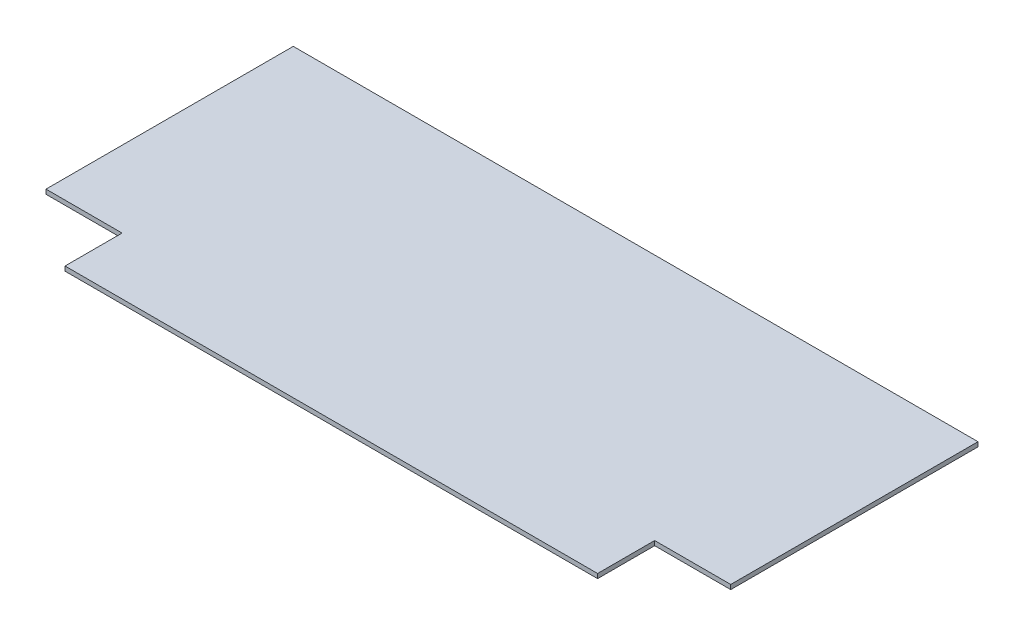
ISO-10303-21;
HEADER;
FILE_DESCRIPTION(('STEP AP214'),'2;1');
FILE_NAME('part.step','',(''),(''),'','','');
FILE_SCHEMA(('AUTOMOTIVE_DESIGN { 1 0 10303 214 1 1 1 1 }'));
ENDSEC;
DATA;
#1=APPLICATION_CONTEXT('core data for automotive mechanical design processes');
#2=APPLICATION_PROTOCOL_DEFINITION('international standard','automotive_design',2000,#1);
#3=PRODUCT_CONTEXT('',#1,'mechanical');
#4=PRODUCT('Part','Part','',(#3));
#5=PRODUCT_RELATED_PRODUCT_CATEGORY('part','',(#4));
#6=PRODUCT_DEFINITION_FORMATION('','',#4);
#7=PRODUCT_DEFINITION_CONTEXT('part definition',#1,'design');
#8=PRODUCT_DEFINITION('design','',#6,#7);
#9=PRODUCT_DEFINITION_SHAPE('','',#8);
#10=(LENGTH_UNIT() NAMED_UNIT(*) SI_UNIT(.MILLI.,.METRE.));
#11=(NAMED_UNIT(*) PLANE_ANGLE_UNIT() SI_UNIT($,.RADIAN.));
#12=(NAMED_UNIT(*) SI_UNIT($,.STERADIAN.) SOLID_ANGLE_UNIT());
#13=UNCERTAINTY_MEASURE_WITH_UNIT(LENGTH_MEASURE(1.E-05),#10,'distance_accuracy_value','');
#14=(GEOMETRIC_REPRESENTATION_CONTEXT(3) GLOBAL_UNCERTAINTY_ASSIGNED_CONTEXT((#13)) GLOBAL_UNIT_ASSIGNED_CONTEXT((#10,
#11,#12)) REPRESENTATION_CONTEXT('',''));
#15=CARTESIAN_POINT('',(0.,0.,0.));
#16=DIRECTION('',(0.,0.,1.));
#17=DIRECTION('',(1.,0.,0.));
#18=AXIS2_PLACEMENT_3D('',#15,#16,#17);
#19=CARTESIAN_POINT('',(-228.6,3.,101.6));
#20=DIRECTION('',(1.,0.,0.));
#21=DIRECTION('',(0.,0.,-1.));
#22=AXIS2_PLACEMENT_3D('',#19,#20,#21);
#23=PLANE('',#22);
#24=DIRECTION('',(0.,0.,1.));
#25=VECTOR('',#24,1.);
#26=CARTESIAN_POINT('',(-228.6,0.,101.6));
#27=LINE('',#26,#25);
#28=CARTESIAN_POINT('',(-228.6,0.,-101.6));
#29=VERTEX_POINT('',#28);
#30=CARTESIAN_POINT('',(-228.6,0.,63.5));
#31=VERTEX_POINT('',#30);
#32=EDGE_CURVE('E125',#29,#31,#27,.T.);
#33=ORIENTED_EDGE('',*,*,#32,.T.);
#34=DIRECTION('',(0.,1.,0.));
#35=VECTOR('',#34,1.);
#36=CARTESIAN_POINT('',(-228.6,0.,63.5));
#37=LINE('',#36,#35);
#38=CARTESIAN_POINT('',(-228.6,3.,63.5));
#39=VERTEX_POINT('',#38);
#40=EDGE_CURVE('E130',#31,#39,#37,.T.);
#41=ORIENTED_EDGE('',*,*,#40,.T.);
#42=DIRECTION('',(0.,0.,1.));
#43=VECTOR('',#42,1.);
#44=CARTESIAN_POINT('',(-228.6,3.,101.6));
#45=LINE('',#44,#43);
#46=CARTESIAN_POINT('',(-228.6,3.,-101.6));
#47=VERTEX_POINT('',#46);
#48=EDGE_CURVE('E134',#47,#39,#45,.T.);
#49=ORIENTED_EDGE('',*,*,#48,.F.);
#50=DIRECTION('',(0.,-1.,0.));
#51=VECTOR('',#50,1.);
#52=CARTESIAN_POINT('',(-228.6,3.,-101.6));
#53=LINE('',#52,#51);
#54=EDGE_CURVE('E46',#47,#29,#53,.T.);
#55=ORIENTED_EDGE('',*,*,#54,.T.);
#56=EDGE_LOOP('',(#33,#41,#49,#55));
#57=FACE_BOUND('',#56,.T.);
#58=ADVANCED_FACE('F39',(#57),#23,.F.);
#59=CARTESIAN_POINT('',(228.6,3.,101.6));
#60=DIRECTION('',(0.,0.,-1.));
#61=DIRECTION('',(-1.,0.,0.));
#62=AXIS2_PLACEMENT_3D('',#59,#60,#61);
#63=PLANE('',#62);
#64=DIRECTION('',(1.,0.,0.));
#65=VECTOR('',#64,1.);
#66=CARTESIAN_POINT('',(228.6,3.,101.6));
#67=LINE('',#66,#65);
#68=CARTESIAN_POINT('',(-177.8,3.,101.6));
#69=VERTEX_POINT('',#68);
#70=CARTESIAN_POINT('',(177.8,3.,101.6));
#71=VERTEX_POINT('',#70);
#72=EDGE_CURVE('E120',#69,#71,#67,.T.);
#73=ORIENTED_EDGE('',*,*,#72,.F.);
#74=DIRECTION('',(0.,1.,0.));
#75=VECTOR('',#74,1.);
#76=CARTESIAN_POINT('',(-177.8,0.,101.6));
#77=LINE('',#76,#75);
#78=CARTESIAN_POINT('',(-177.8,0.,101.6));
#79=VERTEX_POINT('',#78);
#80=EDGE_CURVE('E106',#79,#69,#77,.T.);
#81=ORIENTED_EDGE('',*,*,#80,.F.);
#82=DIRECTION('',(1.,0.,0.));
#83=VECTOR('',#82,1.);
#84=CARTESIAN_POINT('',(228.6,0.,101.6));
#85=LINE('',#84,#83);
#86=CARTESIAN_POINT('',(177.8,0.,101.6));
#87=VERTEX_POINT('',#86);
#88=EDGE_CURVE('E118',#79,#87,#85,.T.);
#89=ORIENTED_EDGE('',*,*,#88,.T.);
#90=DIRECTION('',(0.,1.,0.));
#91=VECTOR('',#90,1.);
#92=CARTESIAN_POINT('',(177.8,0.,101.6));
#93=LINE('',#92,#91);
#94=EDGE_CURVE('E159',#87,#71,#93,.T.);
#95=ORIENTED_EDGE('',*,*,#94,.T.);
#96=EDGE_LOOP('',(#73,#81,#89,#95));
#97=FACE_BOUND('',#96,.T.);
#98=ADVANCED_FACE('F116',(#97),#63,.F.);
#99=CARTESIAN_POINT('',(228.6,3.,101.6));
#100=DIRECTION('',(-1.,0.,0.));
#101=DIRECTION('',(0.,0.,1.));
#102=AXIS2_PLACEMENT_3D('',#99,#100,#101);
#103=PLANE('',#102);
#104=DIRECTION('',(0.,0.,-1.));
#105=VECTOR('',#104,1.);
#106=CARTESIAN_POINT('',(228.6,3.,101.6));
#107=LINE('',#106,#105);
#108=CARTESIAN_POINT('',(228.6,3.,63.4999999999999));
#109=VERTEX_POINT('',#108);
#110=CARTESIAN_POINT('',(228.6,3.,-101.6));
#111=VERTEX_POINT('',#110);
#112=EDGE_CURVE('E141',#109,#111,#107,.T.);
#113=ORIENTED_EDGE('',*,*,#112,.F.);
#114=DIRECTION('',(0.,1.,0.));
#115=VECTOR('',#114,1.);
#116=CARTESIAN_POINT('',(228.6,0.,63.4999999999999));
#117=LINE('',#116,#115);
#118=CARTESIAN_POINT('',(228.6,0.,63.4999999999999));
#119=VERTEX_POINT('',#118);
#120=EDGE_CURVE('E153',#119,#109,#117,.T.);
#121=ORIENTED_EDGE('',*,*,#120,.F.);
#122=DIRECTION('',(0.,0.,-1.));
#123=VECTOR('',#122,1.);
#124=CARTESIAN_POINT('',(228.6,0.,101.6));
#125=LINE('',#124,#123);
#126=CARTESIAN_POINT('',(228.6,0.,-101.6));
#127=VERTEX_POINT('',#126);
#128=EDGE_CURVE('E124',#119,#127,#125,.T.);
#129=ORIENTED_EDGE('',*,*,#128,.T.);
#130=DIRECTION('',(0.,-1.,0.));
#131=VECTOR('',#130,1.);
#132=CARTESIAN_POINT('',(228.6,3.,-101.6));
#133=LINE('',#132,#131);
#134=EDGE_CURVE('E11',#111,#127,#133,.T.);
#135=ORIENTED_EDGE('',*,*,#134,.F.);
#136=EDGE_LOOP('',(#113,#121,#129,#135));
#137=FACE_BOUND('',#136,.T.);
#138=ADVANCED_FACE('F189',(#137),#103,.F.);
#139=CARTESIAN_POINT('',(228.6,3.,-101.6));
#140=DIRECTION('',(0.,0.,1.));
#141=DIRECTION('',(1.,0.,0.));
#142=AXIS2_PLACEMENT_3D('',#139,#140,#141);
#143=PLANE('',#142);
#144=DIRECTION('',(-1.,0.,0.));
#145=VECTOR('',#144,1.);
#146=CARTESIAN_POINT('',(228.6,0.,-101.6));
#147=LINE('',#146,#145);
#148=EDGE_CURVE('E127',#127,#29,#147,.T.);
#149=ORIENTED_EDGE('',*,*,#148,.T.);
#150=ORIENTED_EDGE('',*,*,#54,.F.);
#151=DIRECTION('',(-1.,0.,0.));
#152=VECTOR('',#151,1.);
#153=CARTESIAN_POINT('',(228.6,3.,-101.6));
#154=LINE('',#153,#152);
#155=EDGE_CURVE('E136',#111,#47,#154,.T.);
#156=ORIENTED_EDGE('',*,*,#155,.F.);
#157=ORIENTED_EDGE('',*,*,#134,.T.);
#158=EDGE_LOOP('',(#149,#150,#156,#157));
#159=FACE_BOUND('',#158,.T.);
#160=ADVANCED_FACE('F193',(#159),#143,.F.);
#161=CARTESIAN_POINT('',(0.,3.,0.));
#162=DIRECTION('',(0.,1.,0.));
#163=DIRECTION('',(0.,0.,1.));
#164=AXIS2_PLACEMENT_3D('',#161,#162,#163);
#165=PLANE('',#164);
#166=DIRECTION('',(-1.,0.,0.));
#167=VECTOR('',#166,1.);
#168=CARTESIAN_POINT('',(-228.6,3.,63.5));
#169=LINE('',#168,#167);
#170=CARTESIAN_POINT('',(-177.8,3.,63.5));
#171=VERTEX_POINT('',#170);
#172=EDGE_CURVE('E111',#171,#39,#169,.T.);
#173=ORIENTED_EDGE('',*,*,#172,.F.);
#174=DIRECTION('',(0.,0.,-1.));
#175=VECTOR('',#174,1.);
#176=CARTESIAN_POINT('',(-177.8,3.,101.6));
#177=LINE('',#176,#175);
#178=EDGE_CURVE('E157',#69,#171,#177,.T.);
#179=ORIENTED_EDGE('',*,*,#178,.F.);
#180=ORIENTED_EDGE('',*,*,#72,.T.);
#181=DIRECTION('',(0.,0.,1.));
#182=VECTOR('',#181,1.);
#183=CARTESIAN_POINT('',(177.8,3.,101.6));
#184=LINE('',#183,#182);
#185=CARTESIAN_POINT('',(177.8,3.,63.4999999999999));
#186=VERTEX_POINT('',#185);
#187=EDGE_CURVE('E151',#186,#71,#184,.T.);
#188=ORIENTED_EDGE('',*,*,#187,.F.);
#189=DIRECTION('',(-1.,0.,0.));
#190=VECTOR('',#189,1.);
#191=CARTESIAN_POINT('',(228.6,3.,63.4999999999999));
#192=LINE('',#191,#190);
#193=EDGE_CURVE('E154',#109,#186,#192,.T.);
#194=ORIENTED_EDGE('',*,*,#193,.F.);
#195=ORIENTED_EDGE('',*,*,#112,.T.);
#196=ORIENTED_EDGE('',*,*,#155,.T.);
#197=ORIENTED_EDGE('',*,*,#48,.T.);
#198=EDGE_LOOP('',(#173,#179,#180,#188,#194,#195,#196,#197));
#199=FACE_BOUND('',#198,.T.);
#200=ADVANCED_FACE('F171',(#199),#165,.T.);
#201=CARTESIAN_POINT('',(0.,0.,0.));
#202=DIRECTION('',(0.,1.,0.));
#203=DIRECTION('',(0.,0.,1.));
#204=AXIS2_PLACEMENT_3D('',#201,#202,#203);
#205=PLANE('',#204);
#206=DIRECTION('',(0.,0.,-1.));
#207=VECTOR('',#206,1.);
#208=CARTESIAN_POINT('',(-177.8,0.,101.6));
#209=LINE('',#208,#207);
#210=CARTESIAN_POINT('',(-177.8,0.,63.5));
#211=VERTEX_POINT('',#210);
#212=EDGE_CURVE('E102',#79,#211,#209,.T.);
#213=ORIENTED_EDGE('',*,*,#212,.T.);
#214=DIRECTION('',(-1.,0.,0.));
#215=VECTOR('',#214,1.);
#216=CARTESIAN_POINT('',(-228.6,0.,63.5));
#217=LINE('',#216,#215);
#218=EDGE_CURVE('E53',#211,#31,#217,.T.);
#219=ORIENTED_EDGE('',*,*,#218,.T.);
#220=ORIENTED_EDGE('',*,*,#32,.F.);
#221=ORIENTED_EDGE('',*,*,#148,.F.);
#222=ORIENTED_EDGE('',*,*,#128,.F.);
#223=DIRECTION('',(-1.,0.,0.));
#224=VECTOR('',#223,1.);
#225=CARTESIAN_POINT('',(228.6,0.,63.4999999999999));
#226=LINE('',#225,#224);
#227=CARTESIAN_POINT('',(177.8,0.,63.4999999999999));
#228=VERTEX_POINT('',#227);
#229=EDGE_CURVE('E149',#119,#228,#226,.T.);
#230=ORIENTED_EDGE('',*,*,#229,.T.);
#231=DIRECTION('',(0.,0.,1.));
#232=VECTOR('',#231,1.);
#233=CARTESIAN_POINT('',(177.8,0.,101.6));
#234=LINE('',#233,#232);
#235=EDGE_CURVE('E61',#228,#87,#234,.T.);
#236=ORIENTED_EDGE('',*,*,#235,.T.);
#237=ORIENTED_EDGE('',*,*,#88,.F.);
#238=EDGE_LOOP('',(#213,#219,#220,#221,#222,#230,#236,#237));
#239=FACE_BOUND('',#238,.T.);
#240=ADVANCED_FACE('F122',(#239),#205,.F.);
#241=CARTESIAN_POINT('',(177.8,0.,101.6));
#242=DIRECTION('',(-1.,0.,0.));
#243=DIRECTION('',(0.,0.,1.));
#244=AXIS2_PLACEMENT_3D('',#241,#242,#243);
#245=PLANE('',#244);
#246=ORIENTED_EDGE('',*,*,#187,.T.);
#247=ORIENTED_EDGE('',*,*,#94,.F.);
#248=ORIENTED_EDGE('',*,*,#235,.F.);
#249=DIRECTION('',(0.,1.,0.));
#250=VECTOR('',#249,1.);
#251=CARTESIAN_POINT('',(177.8,0.,63.4999999999999));
#252=LINE('',#251,#250);
#253=EDGE_CURVE('E161',#228,#186,#252,.T.);
#254=ORIENTED_EDGE('',*,*,#253,.T.);
#255=EDGE_LOOP('',(#246,#247,#248,#254));
#256=FACE_BOUND('',#255,.T.);
#257=ADVANCED_FACE('F181',(#256),#245,.F.);
#258=CARTESIAN_POINT('',(228.6,0.,63.4999999999999));
#259=DIRECTION('',(0.,0.,-1.));
#260=DIRECTION('',(-1.,0.,0.));
#261=AXIS2_PLACEMENT_3D('',#258,#259,#260);
#262=PLANE('',#261);
#263=ORIENTED_EDGE('',*,*,#193,.T.);
#264=ORIENTED_EDGE('',*,*,#253,.F.);
#265=ORIENTED_EDGE('',*,*,#229,.F.);
#266=ORIENTED_EDGE('',*,*,#120,.T.);
#267=EDGE_LOOP('',(#263,#264,#265,#266));
#268=FACE_BOUND('',#267,.T.);
#269=ADVANCED_FACE('F174',(#268),#262,.F.);
#270=CARTESIAN_POINT('',(-228.6,0.,63.5));
#271=DIRECTION('',(0.,0.,-1.));
#272=DIRECTION('',(-1.,0.,0.));
#273=AXIS2_PLACEMENT_3D('',#270,#271,#272);
#274=PLANE('',#273);
#275=ORIENTED_EDGE('',*,*,#172,.T.);
#276=ORIENTED_EDGE('',*,*,#40,.F.);
#277=ORIENTED_EDGE('',*,*,#218,.F.);
#278=DIRECTION('',(0.,1.,0.));
#279=VECTOR('',#278,1.);
#280=CARTESIAN_POINT('',(-177.8,0.,63.5));
#281=LINE('',#280,#279);
#282=EDGE_CURVE('E108',#211,#171,#281,.T.);
#283=ORIENTED_EDGE('',*,*,#282,.T.);
#284=EDGE_LOOP('',(#275,#276,#277,#283));
#285=FACE_BOUND('',#284,.T.);
#286=ADVANCED_FACE('F172',(#285),#274,.F.);
#287=CARTESIAN_POINT('',(-177.8,0.,101.6));
#288=DIRECTION('',(1.,0.,0.));
#289=DIRECTION('',(0.,0.,-1.));
#290=AXIS2_PLACEMENT_3D('',#287,#288,#289);
#291=PLANE('',#290);
#292=ORIENTED_EDGE('',*,*,#178,.T.);
#293=ORIENTED_EDGE('',*,*,#282,.F.);
#294=ORIENTED_EDGE('',*,*,#212,.F.);
#295=ORIENTED_EDGE('',*,*,#80,.T.);
#296=EDGE_LOOP('',(#292,#293,#294,#295));
#297=FACE_BOUND('',#296,.T.);
#298=ADVANCED_FACE('F105',(#297),#291,.F.);
#299=CLOSED_SHELL('',(#58,#98,#138,#160,#200,#240,#257,#269,#286,#298));
#300=MANIFOLD_SOLID_BREP('B2',#299);
#301=ADVANCED_BREP_SHAPE_REPRESENTATION('',(#18,#300),#14);
#302=SHAPE_DEFINITION_REPRESENTATION(#9,#301);
ENDSEC;
END-ISO-10303-21;
